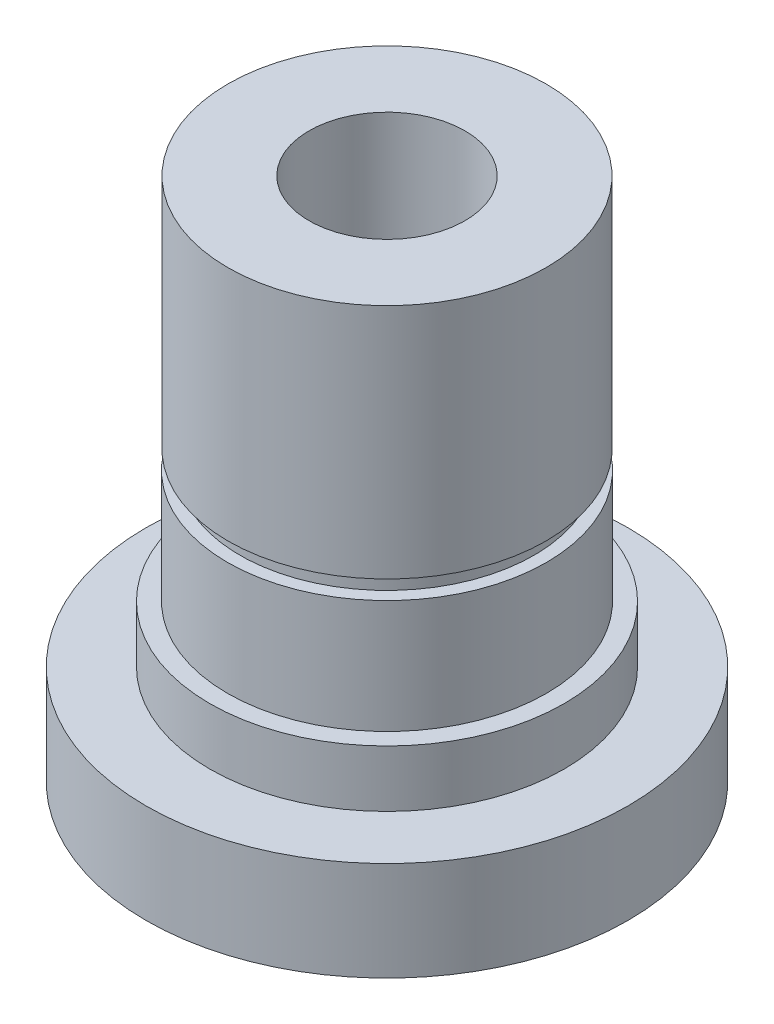
ISO-10303-21;
HEADER;
FILE_DESCRIPTION(('STEP AP214'),'2;1');
FILE_NAME('part.step','',(''),(''),'','','');
FILE_SCHEMA(('AUTOMOTIVE_DESIGN { 1 0 10303 214 1 1 1 1 }'));
ENDSEC;
DATA;
#1=APPLICATION_CONTEXT('core data for automotive mechanical design processes');
#2=APPLICATION_PROTOCOL_DEFINITION('international standard','automotive_design',2000,#1);
#3=PRODUCT_CONTEXT('',#1,'mechanical');
#4=PRODUCT('Part','Part','',(#3));
#5=PRODUCT_RELATED_PRODUCT_CATEGORY('part','',(#4));
#6=PRODUCT_DEFINITION_FORMATION('','',#4);
#7=PRODUCT_DEFINITION_CONTEXT('part definition',#1,'design');
#8=PRODUCT_DEFINITION('design','',#6,#7);
#9=PRODUCT_DEFINITION_SHAPE('','',#8);
#10=(LENGTH_UNIT() NAMED_UNIT(*) SI_UNIT(.MILLI.,.METRE.));
#11=(NAMED_UNIT(*) PLANE_ANGLE_UNIT() SI_UNIT($,.RADIAN.));
#12=(NAMED_UNIT(*) SI_UNIT($,.STERADIAN.) SOLID_ANGLE_UNIT());
#13=UNCERTAINTY_MEASURE_WITH_UNIT(LENGTH_MEASURE(1.E-05),#10,'distance_accuracy_value','');
#14=(GEOMETRIC_REPRESENTATION_CONTEXT(3) GLOBAL_UNCERTAINTY_ASSIGNED_CONTEXT((#13)) GLOBAL_UNIT_ASSIGNED_CONTEXT((#10,
#11,#12)) REPRESENTATION_CONTEXT('',''));
#15=CARTESIAN_POINT('',(0.,0.,0.));
#16=DIRECTION('',(0.,0.,1.));
#17=DIRECTION('',(1.,0.,0.));
#18=AXIS2_PLACEMENT_3D('',#15,#16,#17);
#19=CARTESIAN_POINT('',(0.,0.,0.));
#20=DIRECTION('',(0.,-1.,0.));
#21=DIRECTION('',(0.,0.,-1.));
#22=AXIS2_PLACEMENT_3D('',#19,#20,#21);
#23=CYLINDRICAL_SURFACE('',#22,34.);
#24=CARTESIAN_POINT('',(0.,0.,0.));
#25=DIRECTION('',(0.,-1.,0.));
#26=DIRECTION('',(0.,0.,-1.));
#27=AXIS2_PLACEMENT_3D('',#24,#25,#26);
#28=CIRCLE('',#27,34.);
#29=CARTESIAN_POINT('',(0.,0.,-34.));
#30=VERTEX_POINT('',#29);
#31=EDGE_CURVE('E87',#30,#30,#28,.T.);
#32=ORIENTED_EDGE('',*,*,#31,.F.);
#33=EDGE_LOOP('',(#32));
#34=FACE_BOUND('',#33,.T.);
#35=CARTESIAN_POINT('',(0.,14.,0.));
#36=DIRECTION('',(0.,-1.,0.));
#37=DIRECTION('',(0.,0.,-1.));
#38=AXIS2_PLACEMENT_3D('',#35,#36,#37);
#39=CIRCLE('',#38,34.);
#40=CARTESIAN_POINT('',(0.,14.,-34.));
#41=VERTEX_POINT('',#40);
#42=EDGE_CURVE('E12',#41,#41,#39,.T.);
#43=ORIENTED_EDGE('',*,*,#42,.T.);
#44=EDGE_LOOP('',(#43));
#45=FACE_BOUND('',#44,.T.);
#46=ADVANCED_FACE('F46',(#34,#45),#23,.T.);
#47=CARTESIAN_POINT('',(-34.,14.,0.));
#48=DIRECTION('',(0.,-1.,0.));
#49=DIRECTION('',(0.,0.,-1.));
#50=AXIS2_PLACEMENT_3D('',#47,#48,#49);
#51=PLANE('',#50);
#52=ORIENTED_EDGE('',*,*,#42,.F.);
#53=EDGE_LOOP('',(#52));
#54=FACE_BOUND('',#53,.T.);
#55=CARTESIAN_POINT('',(0.,14.,0.));
#56=DIRECTION('',(0.,-1.,0.));
#57=DIRECTION('',(0.,0.,-1.));
#58=AXIS2_PLACEMENT_3D('',#55,#56,#57);
#59=CIRCLE('',#58,25.);
#60=CARTESIAN_POINT('',(0.,14.,-25.));
#61=VERTEX_POINT('',#60);
#62=EDGE_CURVE('E53',#61,#61,#59,.T.);
#63=ORIENTED_EDGE('',*,*,#62,.T.);
#64=EDGE_LOOP('',(#63));
#65=FACE_BOUND('',#64,.T.);
#66=ADVANCED_FACE('F203',(#54,#65),#51,.F.);
#67=CARTESIAN_POINT('',(0.,0.,0.));
#68=DIRECTION('',(0.,-1.,0.));
#69=DIRECTION('',(0.,0.,-1.));
#70=AXIS2_PLACEMENT_3D('',#67,#68,#69);
#71=CYLINDRICAL_SURFACE('',#70,25.);
#72=CARTESIAN_POINT('',(0.,22.,0.));
#73=DIRECTION('',(0.,-1.,0.));
#74=DIRECTION('',(0.,0.,-1.));
#75=AXIS2_PLACEMENT_3D('',#72,#73,#74);
#76=CIRCLE('',#75,25.);
#77=CARTESIAN_POINT('',(0.,22.,-25.));
#78=VERTEX_POINT('',#77);
#79=EDGE_CURVE('E115',#78,#78,#76,.T.);
#80=ORIENTED_EDGE('',*,*,#79,.T.);
#81=EDGE_LOOP('',(#80));
#82=FACE_BOUND('',#81,.T.);
#83=ORIENTED_EDGE('',*,*,#62,.F.);
#84=EDGE_LOOP('',(#83));
#85=FACE_BOUND('',#84,.T.);
#86=ADVANCED_FACE('F121',(#82,#85),#71,.T.);
#87=CARTESIAN_POINT('',(-25.,74.,0.));
#88=DIRECTION('',(0.,-1.,0.));
#89=DIRECTION('',(0.,0.,-1.));
#90=AXIS2_PLACEMENT_3D('',#87,#88,#89);
#91=PLANE('',#90);
#92=CARTESIAN_POINT('',(0.,74.,0.));
#93=DIRECTION('',(0.,-1.,0.));
#94=DIRECTION('',(0.,0.,-1.));
#95=AXIS2_PLACEMENT_3D('',#92,#93,#94);
#96=CIRCLE('',#95,22.45);
#97=CARTESIAN_POINT('',(0.,74.,-22.45));
#98=VERTEX_POINT('',#97);
#99=EDGE_CURVE('E91',#98,#98,#96,.T.);
#100=ORIENTED_EDGE('',*,*,#99,.F.);
#101=EDGE_LOOP('',(#100));
#102=FACE_BOUND('',#101,.T.);
#103=CARTESIAN_POINT('',(0.,74.,0.));
#104=DIRECTION('',(0.,-1.,0.));
#105=DIRECTION('',(0.,0.,-1.));
#106=AXIS2_PLACEMENT_3D('',#103,#104,#105);
#107=CIRCLE('',#106,11.);
#108=CARTESIAN_POINT('',(0.,74.,-11.));
#109=VERTEX_POINT('',#108);
#110=EDGE_CURVE('E59',#109,#109,#107,.T.);
#111=ORIENTED_EDGE('',*,*,#110,.T.);
#112=EDGE_LOOP('',(#111));
#113=FACE_BOUND('',#112,.T.);
#114=ADVANCED_FACE('F161',(#102,#113),#91,.F.);
#115=CARTESIAN_POINT('',(0.,0.,0.));
#116=DIRECTION('',(0.,-1.,0.));
#117=DIRECTION('',(0.,0.,-1.));
#118=AXIS2_PLACEMENT_3D('',#115,#116,#117);
#119=CYLINDRICAL_SURFACE('',#118,11.);
#120=ORIENTED_EDGE('',*,*,#110,.F.);
#121=EDGE_LOOP('',(#120));
#122=FACE_BOUND('',#121,.T.);
#123=CARTESIAN_POINT('',(0.,30.,0.));
#124=DIRECTION('',(0.,-1.,0.));
#125=DIRECTION('',(0.,0.,-1.));
#126=AXIS2_PLACEMENT_3D('',#123,#124,#125);
#127=CIRCLE('',#126,11.);
#128=CARTESIAN_POINT('',(0.,30.,-11.));
#129=VERTEX_POINT('',#128);
#130=EDGE_CURVE('E65',#129,#129,#127,.T.);
#131=ORIENTED_EDGE('',*,*,#130,.T.);
#132=EDGE_LOOP('',(#131));
#133=FACE_BOUND('',#132,.T.);
#134=ADVANCED_FACE('F164',(#122,#133),#119,.F.);
#135=CARTESIAN_POINT('',(-11.,30.,0.));
#136=DIRECTION('',(0.,-1.,0.));
#137=DIRECTION('',(0.,0.,-1.));
#138=AXIS2_PLACEMENT_3D('',#135,#136,#137);
#139=PLANE('',#138);
#140=ORIENTED_EDGE('',*,*,#130,.F.);
#141=EDGE_LOOP('',(#140));
#142=FACE_BOUND('',#141,.T.);
#143=CARTESIAN_POINT('',(0.,30.,0.));
#144=DIRECTION('',(0.,-1.,0.));
#145=DIRECTION('',(0.,0.,-1.));
#146=AXIS2_PLACEMENT_3D('',#143,#144,#145);
#147=CIRCLE('',#146,3.25);
#148=CARTESIAN_POINT('',(0.,30.,-3.25));
#149=VERTEX_POINT('',#148);
#150=EDGE_CURVE('E71',#149,#149,#147,.T.);
#151=ORIENTED_EDGE('',*,*,#150,.T.);
#152=EDGE_LOOP('',(#151));
#153=FACE_BOUND('',#152,.T.);
#154=ADVANCED_FACE('F170',(#142,#153),#139,.F.);
#155=CARTESIAN_POINT('',(0.,0.,0.));
#156=DIRECTION('',(0.,-1.,0.));
#157=DIRECTION('',(0.,0.,-1.));
#158=AXIS2_PLACEMENT_3D('',#155,#156,#157);
#159=CYLINDRICAL_SURFACE('',#158,3.25);
#160=ORIENTED_EDGE('',*,*,#150,.F.);
#161=EDGE_LOOP('',(#160));
#162=FACE_BOUND('',#161,.T.);
#163=CARTESIAN_POINT('',(0.,10.,0.));
#164=DIRECTION('',(0.,-1.,0.));
#165=DIRECTION('',(0.,0.,-1.));
#166=AXIS2_PLACEMENT_3D('',#163,#164,#165);
#167=CIRCLE('',#166,3.25);
#168=CARTESIAN_POINT('',(0.,10.,-3.25));
#169=VERTEX_POINT('',#168);
#170=EDGE_CURVE('E75',#169,#169,#167,.T.);
#171=ORIENTED_EDGE('',*,*,#170,.T.);
#172=EDGE_LOOP('',(#171));
#173=FACE_BOUND('',#172,.T.);
#174=ADVANCED_FACE('F176',(#162,#173),#159,.F.);
#175=CARTESIAN_POINT('',(-3.25,10.,0.));
#176=DIRECTION('',(0.,1.,0.));
#177=DIRECTION('',(0.,0.,1.));
#178=AXIS2_PLACEMENT_3D('',#175,#176,#177);
#179=PLANE('',#178);
#180=ORIENTED_EDGE('',*,*,#170,.F.);
#181=EDGE_LOOP('',(#180));
#182=FACE_BOUND('',#181,.T.);
#183=CARTESIAN_POINT('',(0.,10.,0.));
#184=DIRECTION('',(0.,-1.,0.));
#185=DIRECTION('',(0.,0.,-1.));
#186=AXIS2_PLACEMENT_3D('',#183,#184,#185);
#187=CIRCLE('',#186,6.);
#188=CARTESIAN_POINT('',(0.,10.,-6.));
#189=VERTEX_POINT('',#188);
#190=EDGE_CURVE('E79',#189,#189,#187,.T.);
#191=ORIENTED_EDGE('',*,*,#190,.T.);
#192=EDGE_LOOP('',(#191));
#193=FACE_BOUND('',#192,.T.);
#194=ADVANCED_FACE('F182',(#182,#193),#179,.F.);
#195=CARTESIAN_POINT('',(0.,0.,0.));
#196=DIRECTION('',(0.,-1.,0.));
#197=DIRECTION('',(0.,0.,-1.));
#198=AXIS2_PLACEMENT_3D('',#195,#196,#197);
#199=CYLINDRICAL_SURFACE('',#198,6.);
#200=ORIENTED_EDGE('',*,*,#190,.F.);
#201=EDGE_LOOP('',(#200));
#202=FACE_BOUND('',#201,.T.);
#203=CARTESIAN_POINT('',(0.,0.,0.));
#204=DIRECTION('',(0.,-1.,0.));
#205=DIRECTION('',(0.,0.,-1.));
#206=AXIS2_PLACEMENT_3D('',#203,#204,#205);
#207=CIRCLE('',#206,6.);
#208=CARTESIAN_POINT('',(0.,0.,-6.));
#209=VERTEX_POINT('',#208);
#210=EDGE_CURVE('E83',#209,#209,#207,.T.);
#211=ORIENTED_EDGE('',*,*,#210,.T.);
#212=EDGE_LOOP('',(#211));
#213=FACE_BOUND('',#212,.T.);
#214=ADVANCED_FACE('F188',(#202,#213),#199,.F.);
#215=CARTESIAN_POINT('',(-6.,0.,0.));
#216=DIRECTION('',(0.,1.,0.));
#217=DIRECTION('',(0.,0.,1.));
#218=AXIS2_PLACEMENT_3D('',#215,#216,#217);
#219=PLANE('',#218);
#220=ORIENTED_EDGE('',*,*,#210,.F.);
#221=EDGE_LOOP('',(#220));
#222=FACE_BOUND('',#221,.T.);
#223=ORIENTED_EDGE('',*,*,#31,.T.);
#224=EDGE_LOOP('',(#223));
#225=FACE_BOUND('',#224,.T.);
#226=ADVANCED_FACE('F157',(#222,#225),#219,.F.);
#227=CARTESIAN_POINT('',(0.,0.,0.));
#228=DIRECTION('',(0.,-1.,0.));
#229=DIRECTION('',(0.,0.,-1.));
#230=AXIS2_PLACEMENT_3D('',#227,#228,#229);
#231=CYLINDRICAL_SURFACE('',#230,22.45);
#232=CARTESIAN_POINT('',(0.,40.6,0.));
#233=DIRECTION('',(0.,-1.,0.));
#234=DIRECTION('',(0.,0.,-1.));
#235=AXIS2_PLACEMENT_3D('',#232,#233,#234);
#236=CIRCLE('',#235,22.45);
#237=CARTESIAN_POINT('',(0.,40.6,-22.45));
#238=VERTEX_POINT('',#237);
#239=EDGE_CURVE('E95',#238,#238,#236,.T.);
#240=ORIENTED_EDGE('',*,*,#239,.F.);
#241=EDGE_LOOP('',(#240));
#242=FACE_BOUND('',#241,.T.);
#243=ORIENTED_EDGE('',*,*,#99,.T.);
#244=EDGE_LOOP('',(#243));
#245=FACE_BOUND('',#244,.T.);
#246=ADVANCED_FACE('F151',(#242,#245),#231,.T.);
#247=CARTESIAN_POINT('',(22.45,40.6,0.));
#248=DIRECTION('',(0.,1.,0.));
#249=DIRECTION('',(0.,0.,1.));
#250=AXIS2_PLACEMENT_3D('',#247,#248,#249);
#251=PLANE('',#250);
#252=CARTESIAN_POINT('',(0.,40.6,0.));
#253=DIRECTION('',(0.,-1.,0.));
#254=DIRECTION('',(0.,0.,-1.));
#255=AXIS2_PLACEMENT_3D('',#252,#253,#254);
#256=CIRCLE('',#255,20.75);
#257=CARTESIAN_POINT('',(0.,40.6,-20.75));
#258=VERTEX_POINT('',#257);
#259=EDGE_CURVE('E99',#258,#258,#256,.T.);
#260=ORIENTED_EDGE('',*,*,#259,.F.);
#261=EDGE_LOOP('',(#260));
#262=FACE_BOUND('',#261,.T.);
#263=ORIENTED_EDGE('',*,*,#239,.T.);
#264=EDGE_LOOP('',(#263));
#265=FACE_BOUND('',#264,.T.);
#266=ADVANCED_FACE('F145',(#262,#265),#251,.F.);
#267=CARTESIAN_POINT('',(0.,0.,0.));
#268=DIRECTION('',(0.,-1.,0.));
#269=DIRECTION('',(0.,0.,-1.));
#270=AXIS2_PLACEMENT_3D('',#267,#268,#269);
#271=CYLINDRICAL_SURFACE('',#270,20.75);
#272=CARTESIAN_POINT('',(0.,38.,0.));
#273=DIRECTION('',(0.,-1.,0.));
#274=DIRECTION('',(0.,0.,-1.));
#275=AXIS2_PLACEMENT_3D('',#272,#273,#274);
#276=CIRCLE('',#275,20.75);
#277=CARTESIAN_POINT('',(0.,38.,-20.75));
#278=VERTEX_POINT('',#277);
#279=EDGE_CURVE('E103',#278,#278,#276,.T.);
#280=ORIENTED_EDGE('',*,*,#279,.F.);
#281=EDGE_LOOP('',(#280));
#282=FACE_BOUND('',#281,.T.);
#283=ORIENTED_EDGE('',*,*,#259,.T.);
#284=EDGE_LOOP('',(#283));
#285=FACE_BOUND('',#284,.T.);
#286=ADVANCED_FACE('F139',(#282,#285),#271,.T.);
#287=CARTESIAN_POINT('',(20.75,38.,0.));
#288=DIRECTION('',(0.,-1.,0.));
#289=DIRECTION('',(0.,0.,-1.));
#290=AXIS2_PLACEMENT_3D('',#287,#288,#289);
#291=PLANE('',#290);
#292=CARTESIAN_POINT('',(0.,38.,0.));
#293=DIRECTION('',(0.,-1.,0.));
#294=DIRECTION('',(0.,0.,-1.));
#295=AXIS2_PLACEMENT_3D('',#292,#293,#294);
#296=CIRCLE('',#295,22.5);
#297=CARTESIAN_POINT('',(0.,38.,-22.5));
#298=VERTEX_POINT('',#297);
#299=EDGE_CURVE('E107',#298,#298,#296,.T.);
#300=ORIENTED_EDGE('',*,*,#299,.F.);
#301=EDGE_LOOP('',(#300));
#302=FACE_BOUND('',#301,.T.);
#303=ORIENTED_EDGE('',*,*,#279,.T.);
#304=EDGE_LOOP('',(#303));
#305=FACE_BOUND('',#304,.T.);
#306=ADVANCED_FACE('F133',(#302,#305),#291,.F.);
#307=CARTESIAN_POINT('',(0.,0.,0.));
#308=DIRECTION('',(0.,-1.,0.));
#309=DIRECTION('',(0.,0.,-1.));
#310=AXIS2_PLACEMENT_3D('',#307,#308,#309);
#311=CYLINDRICAL_SURFACE('',#310,22.5);
#312=CARTESIAN_POINT('',(0.,22.,0.));
#313=DIRECTION('',(0.,-1.,0.));
#314=DIRECTION('',(0.,0.,-1.));
#315=AXIS2_PLACEMENT_3D('',#312,#313,#314);
#316=CIRCLE('',#315,22.5);
#317=CARTESIAN_POINT('',(0.,22.,-22.5));
#318=VERTEX_POINT('',#317);
#319=EDGE_CURVE('E111',#318,#318,#316,.T.);
#320=ORIENTED_EDGE('',*,*,#319,.F.);
#321=EDGE_LOOP('',(#320));
#322=FACE_BOUND('',#321,.T.);
#323=ORIENTED_EDGE('',*,*,#299,.T.);
#324=EDGE_LOOP('',(#323));
#325=FACE_BOUND('',#324,.T.);
#326=ADVANCED_FACE('F127',(#322,#325),#311,.T.);
#327=CARTESIAN_POINT('',(22.5,22.,0.));
#328=DIRECTION('',(0.,-1.,0.));
#329=DIRECTION('',(0.,0.,-1.));
#330=AXIS2_PLACEMENT_3D('',#327,#328,#329);
#331=PLANE('',#330);
#332=ORIENTED_EDGE('',*,*,#79,.F.);
#333=EDGE_LOOP('',(#332));
#334=FACE_BOUND('',#333,.T.);
#335=ORIENTED_EDGE('',*,*,#319,.T.);
#336=EDGE_LOOP('',(#335));
#337=FACE_BOUND('',#336,.T.);
#338=ADVANCED_FACE('F124',(#334,#337),#331,.F.);
#339=CLOSED_SHELL('',(#46,#66,#86,#114,#134,#154,#174,#194,#214,#226,#246,#266,#286,#306,#326,#338));
#340=MANIFOLD_SOLID_BREP('B2',#339);
#341=ADVANCED_BREP_SHAPE_REPRESENTATION('',(#18,#340),#14);
#342=SHAPE_DEFINITION_REPRESENTATION(#9,#341);
ENDSEC;
END-ISO-10303-21;
